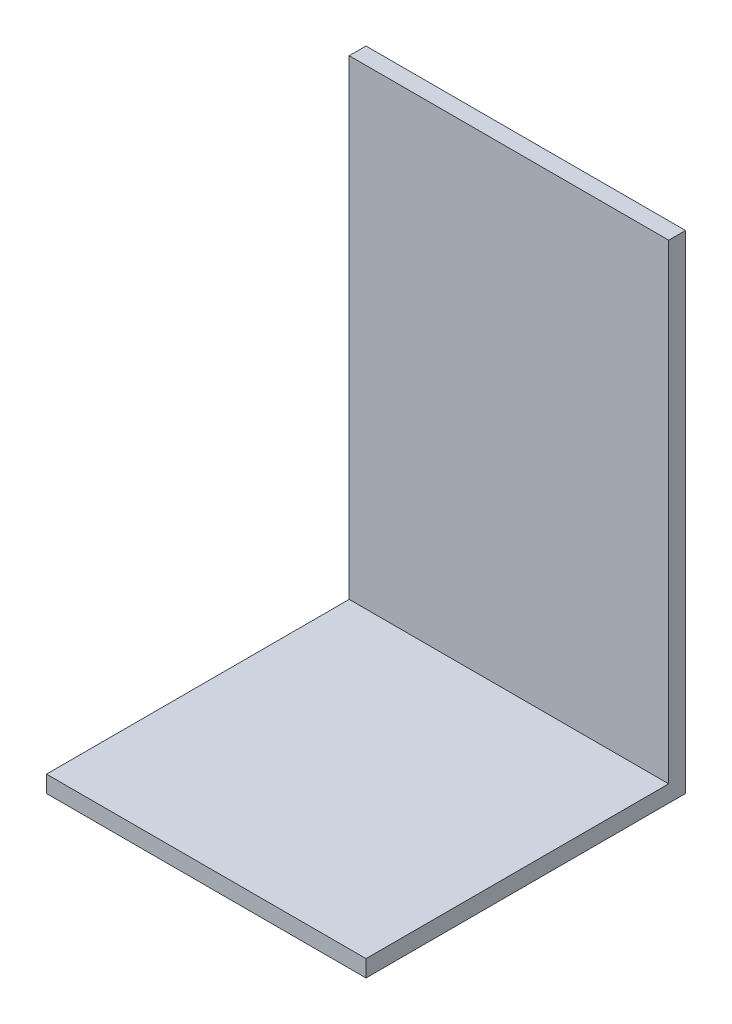
ISO-10303-21;
HEADER;
FILE_DESCRIPTION(('STEP AP214'),'2;1');
FILE_NAME('part.step','',(''),(''),'','','');
FILE_SCHEMA(('AUTOMOTIVE_DESIGN { 1 0 10303 214 1 1 1 1 }'));
ENDSEC;
DATA;
#1=APPLICATION_CONTEXT('core data for automotive mechanical design processes');
#2=APPLICATION_PROTOCOL_DEFINITION('international standard','automotive_design',2000,#1);
#3=PRODUCT_CONTEXT('',#1,'mechanical');
#4=PRODUCT('Part','Part','',(#3));
#5=PRODUCT_RELATED_PRODUCT_CATEGORY('part','',(#4));
#6=PRODUCT_DEFINITION_FORMATION('','',#4);
#7=PRODUCT_DEFINITION_CONTEXT('part definition',#1,'design');
#8=PRODUCT_DEFINITION('design','',#6,#7);
#9=PRODUCT_DEFINITION_SHAPE('','',#8);
#10=(LENGTH_UNIT() NAMED_UNIT(*) SI_UNIT(.MILLI.,.METRE.));
#11=(NAMED_UNIT(*) PLANE_ANGLE_UNIT() SI_UNIT($,.RADIAN.));
#12=(NAMED_UNIT(*) SI_UNIT($,.STERADIAN.) SOLID_ANGLE_UNIT());
#13=UNCERTAINTY_MEASURE_WITH_UNIT(LENGTH_MEASURE(1.E-05),#10,'distance_accuracy_value','');
#14=(GEOMETRIC_REPRESENTATION_CONTEXT(3) GLOBAL_UNCERTAINTY_ASSIGNED_CONTEXT((#13)) GLOBAL_UNIT_ASSIGNED_CONTEXT((#10,
#11,#12)) REPRESENTATION_CONTEXT('',''));
#15=CARTESIAN_POINT('',(0.,0.,0.));
#16=DIRECTION('',(0.,0.,1.));
#17=DIRECTION('',(1.,0.,0.));
#18=AXIS2_PLACEMENT_3D('',#15,#16,#17);
#19=CARTESIAN_POINT('',(-32.0816506224834,2.,-34.7382352941177));
#20=DIRECTION('',(1.,0.,0.));
#21=DIRECTION('',(0.,0.,-1.));
#22=AXIS2_PLACEMENT_3D('',#19,#20,#21);
#23=PLANE('',#22);
#24=DIRECTION('',(0.,0.,1.));
#25=VECTOR('',#24,1.);
#26=CARTESIAN_POINT('',(-32.0816506224834,0.,-34.7382352941177));
#27=LINE('',#26,#25);
#28=CARTESIAN_POINT('',(-32.0816506224834,0.,-34.7382352941177));
#29=VERTEX_POINT('',#28);
#30=CARTESIAN_POINT('',(-32.0816506224834,0.,3.26176470588235));
#31=VERTEX_POINT('',#30);
#32=EDGE_CURVE('E99',#29,#31,#27,.T.);
#33=ORIENTED_EDGE('',*,*,#32,.T.);
#34=DIRECTION('',(0.,-1.,0.));
#35=VECTOR('',#34,1.);
#36=CARTESIAN_POINT('',(-32.0816506224834,2.,3.26176470588235));
#37=LINE('',#36,#35);
#38=CARTESIAN_POINT('',(-32.0816506224834,2.,3.26176470588235));
#39=VERTEX_POINT('',#38);
#40=EDGE_CURVE('E11',#39,#31,#37,.T.);
#41=ORIENTED_EDGE('',*,*,#40,.F.);
#42=DIRECTION('',(0.,0.,1.));
#43=VECTOR('',#42,1.);
#44=CARTESIAN_POINT('',(-32.0816506224834,2.,-34.7382352941177));
#45=LINE('',#44,#43);
#46=CARTESIAN_POINT('',(-32.0816506224834,2.,-32.7382352941177));
#47=VERTEX_POINT('',#46);
#48=EDGE_CURVE('E92',#47,#39,#45,.T.);
#49=ORIENTED_EDGE('',*,*,#48,.F.);
#50=DIRECTION('',(0.,-1.,0.));
#51=VECTOR('',#50,1.);
#52=CARTESIAN_POINT('',(-32.0816506224834,58.,-32.7382352941177));
#53=LINE('',#52,#51);
#54=CARTESIAN_POINT('',(-32.0816506224834,58.,-32.7382352941177));
#55=VERTEX_POINT('',#54);
#56=EDGE_CURVE('E109',#55,#47,#53,.T.);
#57=ORIENTED_EDGE('',*,*,#56,.F.);
#58=DIRECTION('',(0.,0.,1.));
#59=VECTOR('',#58,1.);
#60=CARTESIAN_POINT('',(-32.0816506224834,58.,-34.7382352941177));
#61=LINE('',#60,#59);
#62=CARTESIAN_POINT('',(-32.0816506224834,58.,-34.7382352941177));
#63=VERTEX_POINT('',#62);
#64=EDGE_CURVE('E102',#63,#55,#61,.T.);
#65=ORIENTED_EDGE('',*,*,#64,.F.);
#66=DIRECTION('',(0.,-1.,0.));
#67=VECTOR('',#66,1.);
#68=CARTESIAN_POINT('',(-32.0816506224834,2.,-34.7382352941177));
#69=LINE('',#68,#67);
#70=EDGE_CURVE('E84',#63,#29,#69,.T.);
#71=ORIENTED_EDGE('',*,*,#70,.T.);
#72=EDGE_LOOP('',(#33,#41,#49,#57,#65,#71));
#73=FACE_BOUND('',#72,.T.);
#74=ADVANCED_FACE('F39',(#73),#23,.F.);
#75=CARTESIAN_POINT('',(-32.0816506224834,2.,3.26176470588235));
#76=DIRECTION('',(0.,0.,-1.));
#77=DIRECTION('',(-1.,0.,0.));
#78=AXIS2_PLACEMENT_3D('',#75,#76,#77);
#79=PLANE('',#78);
#80=DIRECTION('',(1.,0.,0.));
#81=VECTOR('',#80,1.);
#82=CARTESIAN_POINT('',(-32.0816506224834,0.,3.26176470588235));
#83=LINE('',#82,#81);
#84=CARTESIAN_POINT('',(5.91834937751656,0.,3.26176470588235));
#85=VERTEX_POINT('',#84);
#86=EDGE_CURVE('E107',#31,#85,#83,.T.);
#87=ORIENTED_EDGE('',*,*,#86,.T.);
#88=DIRECTION('',(0.,-1.,0.));
#89=VECTOR('',#88,1.);
#90=CARTESIAN_POINT('',(5.91834937751656,2.,3.26176470588235));
#91=LINE('',#90,#89);
#92=CARTESIAN_POINT('',(5.91834937751656,2.,3.26176470588235));
#93=VERTEX_POINT('',#92);
#94=EDGE_CURVE('E47',#93,#85,#91,.T.);
#95=ORIENTED_EDGE('',*,*,#94,.F.);
#96=DIRECTION('',(1.,0.,0.));
#97=VECTOR('',#96,1.);
#98=CARTESIAN_POINT('',(-32.0816506224834,2.,3.26176470588235));
#99=LINE('',#98,#97);
#100=EDGE_CURVE('E60',#39,#93,#99,.T.);
#101=ORIENTED_EDGE('',*,*,#100,.F.);
#102=ORIENTED_EDGE('',*,*,#40,.T.);
#103=EDGE_LOOP('',(#87,#95,#101,#102));
#104=FACE_BOUND('',#103,.T.);
#105=ADVANCED_FACE('F130',(#104),#79,.F.);
#106=CARTESIAN_POINT('',(5.91834937751656,2.,-34.7382352941177));
#107=DIRECTION('',(-1.,0.,0.));
#108=DIRECTION('',(0.,0.,1.));
#109=AXIS2_PLACEMENT_3D('',#106,#107,#108);
#110=PLANE('',#109);
#111=DIRECTION('',(0.,0.,-1.));
#112=VECTOR('',#111,1.);
#113=CARTESIAN_POINT('',(5.91834937751656,0.,-34.7382352941177));
#114=LINE('',#113,#112);
#115=CARTESIAN_POINT('',(5.91834937751656,0.,-34.7382352941177));
#116=VERTEX_POINT('',#115);
#117=EDGE_CURVE('E93',#85,#116,#114,.T.);
#118=ORIENTED_EDGE('',*,*,#117,.T.);
#119=DIRECTION('',(0.,-1.,0.));
#120=VECTOR('',#119,1.);
#121=CARTESIAN_POINT('',(5.91834937751656,2.,-34.7382352941177));
#122=LINE('',#121,#120);
#123=CARTESIAN_POINT('',(5.91834937751656,58.,-34.7382352941177));
#124=VERTEX_POINT('',#123);
#125=EDGE_CURVE('E87',#124,#116,#122,.T.);
#126=ORIENTED_EDGE('',*,*,#125,.F.);
#127=DIRECTION('',(0.,0.,-1.));
#128=VECTOR('',#127,1.);
#129=CARTESIAN_POINT('',(5.91834937751656,58.,-34.7382352941177));
#130=LINE('',#129,#128);
#131=CARTESIAN_POINT('',(5.91834937751656,58.,-32.7382352941177));
#132=VERTEX_POINT('',#131);
#133=EDGE_CURVE('E147',#132,#124,#130,.T.);
#134=ORIENTED_EDGE('',*,*,#133,.F.);
#135=DIRECTION('',(0.,-1.,0.));
#136=VECTOR('',#135,1.);
#137=CARTESIAN_POINT('',(5.91834937751656,58.,-32.7382352941177));
#138=LINE('',#137,#136);
#139=CARTESIAN_POINT('',(5.91834937751656,2.,-32.7382352941177));
#140=VERTEX_POINT('',#139);
#141=EDGE_CURVE('E115',#132,#140,#138,.T.);
#142=ORIENTED_EDGE('',*,*,#141,.T.);
#143=DIRECTION('',(0.,0.,-1.));
#144=VECTOR('',#143,1.);
#145=CARTESIAN_POINT('',(5.91834937751656,2.,-34.7382352941177));
#146=LINE('',#145,#144);
#147=EDGE_CURVE('E104',#93,#140,#146,.T.);
#148=ORIENTED_EDGE('',*,*,#147,.F.);
#149=ORIENTED_EDGE('',*,*,#94,.T.);
#150=EDGE_LOOP('',(#118,#126,#134,#142,#148,#149));
#151=FACE_BOUND('',#150,.T.);
#152=ADVANCED_FACE('F127',(#151),#110,.F.);
#153=CARTESIAN_POINT('',(-32.0816506224834,2.,-34.7382352941177));
#154=DIRECTION('',(0.,0.,1.));
#155=DIRECTION('',(1.,0.,0.));
#156=AXIS2_PLACEMENT_3D('',#153,#154,#155);
#157=PLANE('',#156);
#158=DIRECTION('',(-1.,0.,0.));
#159=VECTOR('',#158,1.);
#160=CARTESIAN_POINT('',(-32.0816506224834,0.,-34.7382352941177));
#161=LINE('',#160,#159);
#162=EDGE_CURVE('E80',#116,#29,#161,.T.);
#163=ORIENTED_EDGE('',*,*,#162,.T.);
#164=ORIENTED_EDGE('',*,*,#70,.F.);
#165=DIRECTION('',(-1.,0.,0.));
#166=VECTOR('',#165,1.);
#167=CARTESIAN_POINT('',(-32.0816506224834,58.,-34.7382352941177));
#168=LINE('',#167,#166);
#169=EDGE_CURVE('E150',#124,#63,#168,.T.);
#170=ORIENTED_EDGE('',*,*,#169,.F.);
#171=ORIENTED_EDGE('',*,*,#125,.T.);
#172=EDGE_LOOP('',(#163,#164,#170,#171));
#173=FACE_BOUND('',#172,.T.);
#174=ADVANCED_FACE('F82',(#173),#157,.F.);
#175=CARTESIAN_POINT('',(0.,2.,0.));
#176=DIRECTION('',(0.,1.,0.));
#177=DIRECTION('',(0.,0.,1.));
#178=AXIS2_PLACEMENT_3D('',#175,#176,#177);
#179=PLANE('',#178);
#180=DIRECTION('',(1.,0.,0.));
#181=VECTOR('',#180,1.);
#182=CARTESIAN_POINT('',(-32.0816506224834,2.,-32.7382352941177));
#183=LINE('',#182,#181);
#184=EDGE_CURVE('E54',#47,#140,#183,.T.);
#185=ORIENTED_EDGE('',*,*,#184,.F.);
#186=ORIENTED_EDGE('',*,*,#48,.T.);
#187=ORIENTED_EDGE('',*,*,#100,.T.);
#188=ORIENTED_EDGE('',*,*,#147,.T.);
#189=EDGE_LOOP('',(#185,#186,#187,#188));
#190=FACE_BOUND('',#189,.T.);
#191=ADVANCED_FACE('F163',(#190),#179,.T.);
#192=CARTESIAN_POINT('',(0.,0.,0.));
#193=DIRECTION('',(0.,1.,0.));
#194=DIRECTION('',(0.,0.,1.));
#195=AXIS2_PLACEMENT_3D('',#192,#193,#194);
#196=PLANE('',#195);
#197=ORIENTED_EDGE('',*,*,#32,.F.);
#198=ORIENTED_EDGE('',*,*,#162,.F.);
#199=ORIENTED_EDGE('',*,*,#117,.F.);
#200=ORIENTED_EDGE('',*,*,#86,.F.);
#201=EDGE_LOOP('',(#197,#198,#199,#200));
#202=FACE_BOUND('',#201,.T.);
#203=ADVANCED_FACE('F106',(#202),#196,.F.);
#204=CARTESIAN_POINT('',(-32.0816506224834,58.,-32.7382352941177));
#205=DIRECTION('',(0.,0.,-1.));
#206=DIRECTION('',(-1.,0.,0.));
#207=AXIS2_PLACEMENT_3D('',#204,#205,#206);
#208=PLANE('',#207);
#209=ORIENTED_EDGE('',*,*,#184,.T.);
#210=ORIENTED_EDGE('',*,*,#141,.F.);
#211=DIRECTION('',(1.,0.,0.));
#212=VECTOR('',#211,1.);
#213=CARTESIAN_POINT('',(-32.0816506224834,58.,-32.7382352941177));
#214=LINE('',#213,#212);
#215=EDGE_CURVE('E140',#55,#132,#214,.T.);
#216=ORIENTED_EDGE('',*,*,#215,.F.);
#217=ORIENTED_EDGE('',*,*,#56,.T.);
#218=EDGE_LOOP('',(#209,#210,#216,#217));
#219=FACE_BOUND('',#218,.T.);
#220=ADVANCED_FACE('F136',(#219),#208,.F.);
#221=CARTESIAN_POINT('',(0.,58.,0.));
#222=DIRECTION('',(0.,1.,0.));
#223=DIRECTION('',(0.,0.,1.));
#224=AXIS2_PLACEMENT_3D('',#221,#222,#223);
#225=PLANE('',#224);
#226=ORIENTED_EDGE('',*,*,#64,.T.);
#227=ORIENTED_EDGE('',*,*,#215,.T.);
#228=ORIENTED_EDGE('',*,*,#133,.T.);
#229=ORIENTED_EDGE('',*,*,#169,.T.);
#230=EDGE_LOOP('',(#226,#227,#228,#229));
#231=FACE_BOUND('',#230,.T.);
#232=ADVANCED_FACE('F149',(#231),#225,.T.);
#233=CLOSED_SHELL('',(#74,#105,#152,#174,#191,#203,#220,#232));
#234=MANIFOLD_SOLID_BREP('B2',#233);
#235=ADVANCED_BREP_SHAPE_REPRESENTATION('',(#18,#234),#14);
#236=SHAPE_DEFINITION_REPRESENTATION(#9,#235);
ENDSEC;
END-ISO-10303-21;
